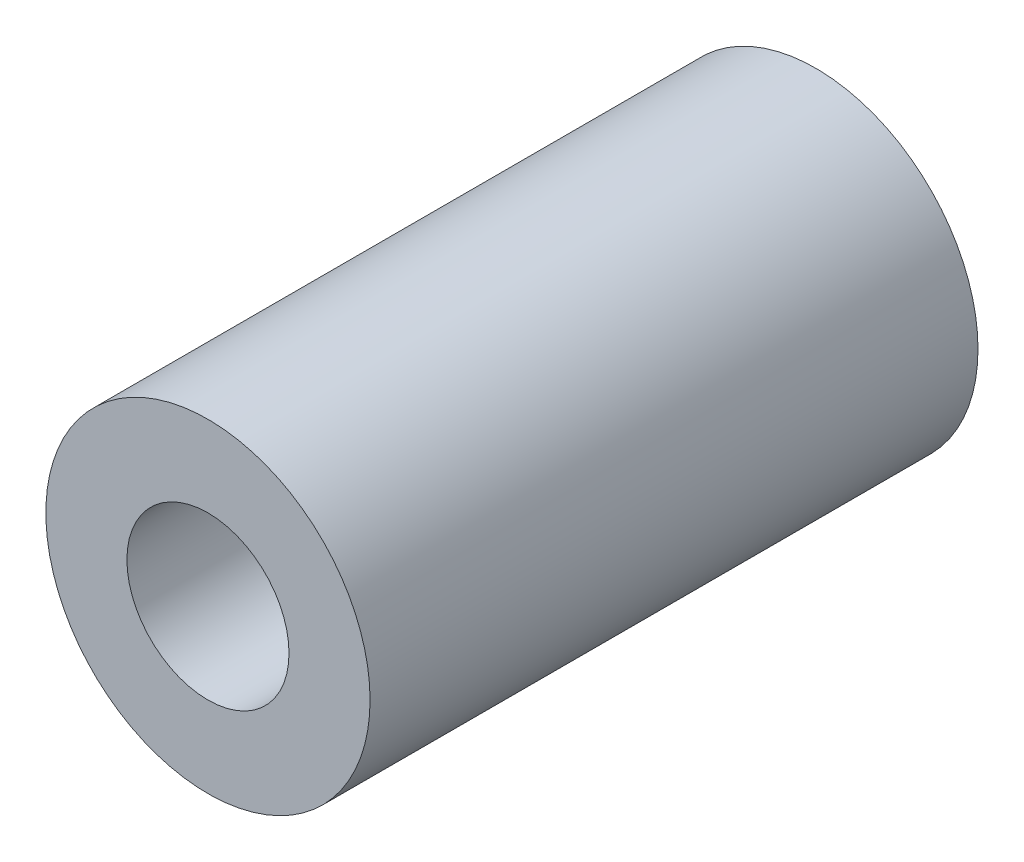
ISO-10303-21;
HEADER;
FILE_DESCRIPTION(('STEP AP214'),'2;1');
FILE_NAME('part.step','',(''),(''),'','','');
FILE_SCHEMA(('AUTOMOTIVE_DESIGN { 1 0 10303 214 1 1 1 1 }'));
ENDSEC;
DATA;
#1=APPLICATION_CONTEXT('core data for automotive mechanical design processes');
#2=APPLICATION_PROTOCOL_DEFINITION('international standard','automotive_design',2000,#1);
#3=PRODUCT_CONTEXT('',#1,'mechanical');
#4=PRODUCT('Part','Part','',(#3));
#5=PRODUCT_RELATED_PRODUCT_CATEGORY('part','',(#4));
#6=PRODUCT_DEFINITION_FORMATION('','',#4);
#7=PRODUCT_DEFINITION_CONTEXT('part definition',#1,'design');
#8=PRODUCT_DEFINITION('design','',#6,#7);
#9=PRODUCT_DEFINITION_SHAPE('','',#8);
#10=(LENGTH_UNIT() NAMED_UNIT(*) SI_UNIT(.MILLI.,.METRE.));
#11=(NAMED_UNIT(*) PLANE_ANGLE_UNIT() SI_UNIT($,.RADIAN.));
#12=(NAMED_UNIT(*) SI_UNIT($,.STERADIAN.) SOLID_ANGLE_UNIT());
#13=UNCERTAINTY_MEASURE_WITH_UNIT(LENGTH_MEASURE(1.E-05),#10,'distance_accuracy_value','');
#14=(GEOMETRIC_REPRESENTATION_CONTEXT(3) GLOBAL_UNCERTAINTY_ASSIGNED_CONTEXT((#13)) GLOBAL_UNIT_ASSIGNED_CONTEXT((#10,
#11,#12)) REPRESENTATION_CONTEXT('',''));
#15=CARTESIAN_POINT('',(0.,0.,0.));
#16=DIRECTION('',(0.,0.,1.));
#17=DIRECTION('',(1.,0.,0.));
#18=AXIS2_PLACEMENT_3D('',#15,#16,#17);
#19=CARTESIAN_POINT('',(0.,0.,0.15));
#20=DIRECTION('',(0.,0.,1.));
#21=DIRECTION('',(1.,0.,0.));
#22=AXIS2_PLACEMENT_3D('',#19,#20,#21);
#23=PLANE('',#22);
#24=CARTESIAN_POINT('',(0.,0.,0.15));
#25=DIRECTION('',(0.,0.,1.));
#26=DIRECTION('',(1.,0.,0.));
#27=AXIS2_PLACEMENT_3D('',#24,#25,#26);
#28=CIRCLE('',#27,0.04);
#29=CARTESIAN_POINT('',(0.04,0.,0.15));
#30=VERTEX_POINT('',#29);
#31=EDGE_CURVE('E10',#30,#30,#28,.T.);
#32=ORIENTED_EDGE('',*,*,#31,.T.);
#33=EDGE_LOOP('',(#32));
#34=FACE_BOUND('',#33,.T.);
#35=CARTESIAN_POINT('',(0.,0.,0.15));
#36=DIRECTION('',(0.,0.,1.));
#37=DIRECTION('',(1.,0.,0.));
#38=AXIS2_PLACEMENT_3D('',#35,#36,#37);
#39=CIRCLE('',#38,0.0199999999999992);
#40=CARTESIAN_POINT('',(0.0199999999999992,0.,0.15));
#41=VERTEX_POINT('',#40);
#42=EDGE_CURVE('E54',#41,#41,#39,.T.);
#43=ORIENTED_EDGE('',*,*,#42,.F.);
#44=EDGE_LOOP('',(#43));
#45=FACE_BOUND('',#44,.T.);
#46=ADVANCED_FACE('F41',(#34,#45),#23,.T.);
#47=CARTESIAN_POINT('',(0.,0.,0.));
#48=DIRECTION('',(0.,0.,1.));
#49=DIRECTION('',(1.,0.,0.));
#50=AXIS2_PLACEMENT_3D('',#47,#48,#49);
#51=PLANE('',#50);
#52=CARTESIAN_POINT('',(0.,0.,0.));
#53=DIRECTION('',(0.,0.,1.));
#54=DIRECTION('',(1.,0.,0.));
#55=AXIS2_PLACEMENT_3D('',#52,#53,#54);
#56=CIRCLE('',#55,0.04);
#57=CARTESIAN_POINT('',(0.04,0.,0.));
#58=VERTEX_POINT('',#57);
#59=EDGE_CURVE('E45',#58,#58,#56,.T.);
#60=ORIENTED_EDGE('',*,*,#59,.F.);
#61=EDGE_LOOP('',(#60));
#62=FACE_BOUND('',#61,.T.);
#63=CARTESIAN_POINT('',(0.,0.,0.));
#64=DIRECTION('',(0.,0.,1.));
#65=DIRECTION('',(1.,0.,0.));
#66=AXIS2_PLACEMENT_3D('',#63,#64,#65);
#67=CIRCLE('',#66,0.0199999999999992);
#68=CARTESIAN_POINT('',(0.0199999999999992,0.,0.));
#69=VERTEX_POINT('',#68);
#70=EDGE_CURVE('E56',#69,#69,#67,.T.);
#71=ORIENTED_EDGE('',*,*,#70,.T.);
#72=EDGE_LOOP('',(#71));
#73=FACE_BOUND('',#72,.T.);
#74=ADVANCED_FACE('F68',(#62,#73),#51,.F.);
#75=CARTESIAN_POINT('',(0.,0.,0.15));
#76=DIRECTION('',(0.,0.,-1.));
#77=DIRECTION('',(-1.,0.,0.));
#78=AXIS2_PLACEMENT_3D('',#75,#76,#77);
#79=CYLINDRICAL_SURFACE('',#78,0.04);
#80=ORIENTED_EDGE('',*,*,#31,.F.);
#81=EDGE_LOOP('',(#80));
#82=FACE_BOUND('',#81,.T.);
#83=ORIENTED_EDGE('',*,*,#59,.T.);
#84=EDGE_LOOP('',(#83));
#85=FACE_BOUND('',#84,.T.);
#86=ADVANCED_FACE('F43',(#82,#85),#79,.T.);
#87=CARTESIAN_POINT('',(0.,0.,0.15));
#88=DIRECTION('',(0.,0.,-1.));
#89=DIRECTION('',(-1.,0.,0.));
#90=AXIS2_PLACEMENT_3D('',#87,#88,#89);
#91=CYLINDRICAL_SURFACE('',#90,0.0199999999999992);
#92=ORIENTED_EDGE('',*,*,#42,.T.);
#93=EDGE_LOOP('',(#92));
#94=FACE_BOUND('',#93,.T.);
#95=ORIENTED_EDGE('',*,*,#70,.F.);
#96=EDGE_LOOP('',(#95));
#97=FACE_BOUND('',#96,.T.);
#98=ADVANCED_FACE('F64',(#94,#97),#91,.F.);
#99=CLOSED_SHELL('',(#46,#74,#86,#98));
#100=MANIFOLD_SOLID_BREP('B2',#99);
#101=ADVANCED_BREP_SHAPE_REPRESENTATION('',(#18,#100),#14);
#102=SHAPE_DEFINITION_REPRESENTATION(#9,#101);
ENDSEC;
END-ISO-10303-21;
